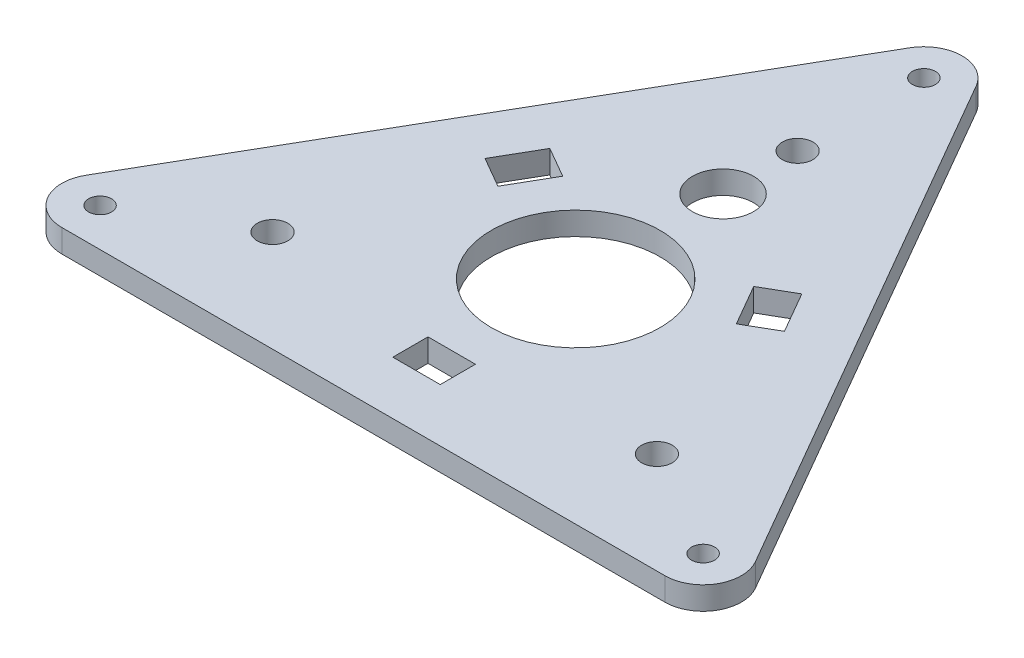
ISO-10303-21;
HEADER;
FILE_DESCRIPTION(('STEP AP214'),'2;1');
FILE_NAME('part.step','',(''),(''),'','','');
FILE_SCHEMA(('AUTOMOTIVE_DESIGN { 1 0 10303 214 1 1 1 1 }'));
ENDSEC;
DATA;
#1=APPLICATION_CONTEXT('core data for automotive mechanical design processes');
#2=APPLICATION_PROTOCOL_DEFINITION('international standard','automotive_design',2000,#1);
#3=PRODUCT_CONTEXT('',#1,'mechanical');
#4=PRODUCT('Part','Part','',(#3));
#5=PRODUCT_RELATED_PRODUCT_CATEGORY('part','',(#4));
#6=PRODUCT_DEFINITION_FORMATION('','',#4);
#7=PRODUCT_DEFINITION_CONTEXT('part definition',#1,'design');
#8=PRODUCT_DEFINITION('design','',#6,#7);
#9=PRODUCT_DEFINITION_SHAPE('','',#8);
#10=(LENGTH_UNIT() NAMED_UNIT(*) SI_UNIT(.MILLI.,.METRE.));
#11=(NAMED_UNIT(*) PLANE_ANGLE_UNIT() SI_UNIT($,.RADIAN.));
#12=(NAMED_UNIT(*) SI_UNIT($,.STERADIAN.) SOLID_ANGLE_UNIT());
#13=UNCERTAINTY_MEASURE_WITH_UNIT(LENGTH_MEASURE(1.E-05),#10,'distance_accuracy_value','');
#14=(GEOMETRIC_REPRESENTATION_CONTEXT(3) GLOBAL_UNCERTAINTY_ASSIGNED_CONTEXT((#13)) GLOBAL_UNIT_ASSIGNED_CONTEXT((#10,
#11,#12)) REPRESENTATION_CONTEXT('',''));
#15=CARTESIAN_POINT('',(0.,0.,0.));
#16=DIRECTION('',(0.,0.,1.));
#17=DIRECTION('',(1.,0.,0.));
#18=AXIS2_PLACEMENT_3D('',#15,#16,#17);
#19=CARTESIAN_POINT('',(0.,3.,-45.5));
#20=DIRECTION('',(0.,1.,0.));
#21=DIRECTION('',(0.,0.,1.));
#22=AXIS2_PLACEMENT_3D('',#19,#20,#21);
#23=PLANE('',#22);
#24=CARTESIAN_POINT('',(25.1147367097487,3.,14.5));
#25=DIRECTION('',(0.,1.,0.));
#26=DIRECTION('',(0.,0.,1.));
#27=AXIS2_PLACEMENT_3D('',#24,#25,#26);
#28=CIRCLE('',#27,2.);
#29=CARTESIAN_POINT('',(25.1147367097487,3.,16.5));
#30=VERTEX_POINT('',#29);
#31=EDGE_CURVE('E268',#30,#30,#28,.T.);
#32=ORIENTED_EDGE('',*,*,#31,.F.);
#33=EDGE_LOOP('',(#32));
#34=FACE_BOUND('',#33,.T.);
#35=CARTESIAN_POINT('',(0.,3.,-29.));
#36=DIRECTION('',(0.,1.,0.));
#37=DIRECTION('',(0.,0.,1.));
#38=AXIS2_PLACEMENT_3D('',#35,#36,#37);
#39=CIRCLE('',#38,2.);
#40=CARTESIAN_POINT('',(0.,3.,-27.));
#41=VERTEX_POINT('',#40);
#42=EDGE_CURVE('E278',#41,#41,#39,.T.);
#43=ORIENTED_EDGE('',*,*,#42,.F.);
#44=EDGE_LOOP('',(#43));
#45=FACE_BOUND('',#44,.T.);
#46=CARTESIAN_POINT('',(39.404155872192,3.,22.75));
#47=DIRECTION('',(0.,1.,0.));
#48=DIRECTION('',(0.,0.,1.));
#49=AXIS2_PLACEMENT_3D('',#46,#47,#48);
#50=CIRCLE('',#49,1.5);
#51=CARTESIAN_POINT('',(39.404155872192,3.,24.25));
#52=VERTEX_POINT('',#51);
#53=EDGE_CURVE('E295',#52,#52,#50,.T.);
#54=ORIENTED_EDGE('',*,*,#53,.F.);
#55=EDGE_LOOP('',(#54));
#56=FACE_BOUND('',#55,.T.);
#57=CARTESIAN_POINT('',(0.,3.,0.));
#58=DIRECTION('',(0.,1.,0.));
#59=DIRECTION('',(0.,0.,1.));
#60=AXIS2_PLACEMENT_3D('',#57,#58,#59);
#61=CIRCLE('',#60,11.025);
#62=CARTESIAN_POINT('',(0.,3.,11.025));
#63=VERTEX_POINT('',#62);
#64=EDGE_CURVE('E304',#63,#63,#61,.T.);
#65=ORIENTED_EDGE('',*,*,#64,.F.);
#66=EDGE_LOOP('',(#65));
#67=FACE_BOUND('',#66,.T.);
#68=CARTESIAN_POINT('',(0.,3.,-45.5));
#69=DIRECTION('',(0.,1.,0.));
#70=DIRECTION('',(0.,0.,1.));
#71=AXIS2_PLACEMENT_3D('',#68,#69,#70);
#72=CIRCLE('',#71,5.00000000000002);
#73=CARTESIAN_POINT('',(4.33012701892221,3.,-48.));
#74=VERTEX_POINT('',#73);
#75=CARTESIAN_POINT('',(-4.33012701892222,3.,-48.));
#76=VERTEX_POINT('',#75);
#77=EDGE_CURVE('E309',#74,#76,#72,.T.);
#78=ORIENTED_EDGE('',*,*,#77,.T.);
#79=DIRECTION('',(-0.5,0.,0.866025403784439));
#80=VECTOR('',#79,1.);
#81=CARTESIAN_POINT('',(-4.33012701892222,3.,-48.));
#82=LINE('',#81,#80);
#83=CARTESIAN_POINT('',(-43.7342828911142,3.,20.25));
#84=VERTEX_POINT('',#83);
#85=EDGE_CURVE('E311',#76,#84,#82,.T.);
#86=ORIENTED_EDGE('',*,*,#85,.T.);
#87=CARTESIAN_POINT('',(-39.404155872192,3.,22.75));
#88=DIRECTION('',(0.,1.,0.));
#89=DIRECTION('',(0.,0.,1.));
#90=AXIS2_PLACEMENT_3D('',#87,#88,#89);
#91=CIRCLE('',#90,5.00000000000002);
#92=CARTESIAN_POINT('',(-39.404155872192,3.,27.75));
#93=VERTEX_POINT('',#92);
#94=EDGE_CURVE('E316',#84,#93,#91,.T.);
#95=ORIENTED_EDGE('',*,*,#94,.T.);
#96=DIRECTION('',(1.,0.,0.));
#97=VECTOR('',#96,1.);
#98=CARTESIAN_POINT('',(-39.404155872192,3.,27.75));
#99=LINE('',#98,#97);
#100=CARTESIAN_POINT('',(39.404155872192,3.,27.7500000000004));
#101=VERTEX_POINT('',#100);
#102=EDGE_CURVE('E318',#93,#101,#99,.T.);
#103=ORIENTED_EDGE('',*,*,#102,.T.);
#104=CARTESIAN_POINT('',(39.4041558721918,3.,22.7500000000003));
#105=DIRECTION('',(0.,1.,0.));
#106=DIRECTION('',(0.,0.,1.));
#107=AXIS2_PLACEMENT_3D('',#104,#105,#106);
#108=CIRCLE('',#107,5.00000000000003);
#109=CARTESIAN_POINT('',(43.7342828911142,3.,20.25));
#110=VERTEX_POINT('',#109);
#111=EDGE_CURVE('E319',#101,#110,#108,.T.);
#112=ORIENTED_EDGE('',*,*,#111,.T.);
#113=DIRECTION('',(-0.5,0.,-0.866025403784438));
#114=VECTOR('',#113,1.);
#115=CARTESIAN_POINT('',(43.7342828911142,3.,20.25));
#116=LINE('',#115,#114);
#117=EDGE_CURVE('E325',#110,#74,#116,.T.);
#118=ORIENTED_EDGE('',*,*,#117,.T.);
#119=EDGE_LOOP('',(#78,#86,#95,#103,#112,#118));
#120=FACE_BOUND('',#119,.T.);
#121=CARTESIAN_POINT('',(0.,3.,-45.5));
#122=DIRECTION('',(0.,1.,0.));
#123=DIRECTION('',(0.,0.,1.));
#124=AXIS2_PLACEMENT_3D('',#121,#122,#123);
#125=CIRCLE('',#124,1.5);
#126=CARTESIAN_POINT('',(0.,3.,-44.));
#127=VERTEX_POINT('',#126);
#128=EDGE_CURVE('E299',#127,#127,#125,.T.);
#129=ORIENTED_EDGE('',*,*,#128,.F.);
#130=EDGE_LOOP('',(#129));
#131=FACE_BOUND('',#130,.T.);
#132=CARTESIAN_POINT('',(-39.404155872192,3.,22.75));
#133=DIRECTION('',(0.,1.,0.));
#134=DIRECTION('',(0.,0.,1.));
#135=AXIS2_PLACEMENT_3D('',#132,#133,#134);
#136=CIRCLE('',#135,1.5);
#137=CARTESIAN_POINT('',(-39.404155872192,3.,24.25));
#138=VERTEX_POINT('',#137);
#139=EDGE_CURVE('E287',#138,#138,#136,.T.);
#140=ORIENTED_EDGE('',*,*,#139,.F.);
#141=EDGE_LOOP('',(#140));
#142=FACE_BOUND('',#141,.T.);
#143=CARTESIAN_POINT('',(0.,3.,-19.25));
#144=DIRECTION('',(0.,1.,0.));
#145=DIRECTION('',(0.,0.,1.));
#146=AXIS2_PLACEMENT_3D('',#143,#144,#145);
#147=CIRCLE('',#146,4.);
#148=CARTESIAN_POINT('',(0.,3.,-15.25));
#149=VERTEX_POINT('',#148);
#150=EDGE_CURVE('E273',#149,#149,#147,.T.);
#151=ORIENTED_EDGE('',*,*,#150,.F.);
#152=EDGE_LOOP('',(#151));
#153=FACE_BOUND('',#152,.T.);
#154=CARTESIAN_POINT('',(-25.1147367097487,3.,14.5));
#155=DIRECTION('',(0.,1.,0.));
#156=DIRECTION('',(0.,0.,1.));
#157=AXIS2_PLACEMENT_3D('',#154,#155,#156);
#158=CIRCLE('',#157,2.);
#159=CARTESIAN_POINT('',(-25.1147367097487,3.,16.5));
#160=VERTEX_POINT('',#159);
#161=EDGE_CURVE('E265',#160,#160,#158,.T.);
#162=ORIENTED_EDGE('',*,*,#161,.F.);
#163=EDGE_LOOP('',(#162));
#164=FACE_BOUND('',#163,.T.);
#165=DIRECTION('',(1.,0.,0.));
#166=VECTOR('',#165,1.);
#167=CARTESIAN_POINT('',(-3.1,3.,20.8));
#168=LINE('',#167,#166);
#169=CARTESIAN_POINT('',(-3.1,3.,20.8));
#170=VERTEX_POINT('',#169);
#171=CARTESIAN_POINT('',(3.1,3.,20.8));
#172=VERTEX_POINT('',#171);
#173=EDGE_CURVE('E233',#170,#172,#168,.T.);
#174=ORIENTED_EDGE('',*,*,#173,.F.);
#175=DIRECTION('',(0.,0.,1.));
#176=VECTOR('',#175,1.);
#177=CARTESIAN_POINT('',(-3.1,3.,16.2));
#178=LINE('',#177,#176);
#179=CARTESIAN_POINT('',(-3.1,3.,16.2));
#180=VERTEX_POINT('',#179);
#181=EDGE_CURVE('E232',#180,#170,#178,.T.);
#182=ORIENTED_EDGE('',*,*,#181,.F.);
#183=DIRECTION('',(-1.,0.,0.));
#184=VECTOR('',#183,1.);
#185=CARTESIAN_POINT('',(-3.1,3.,16.2));
#186=LINE('',#185,#184);
#187=CARTESIAN_POINT('',(3.1,3.,16.2));
#188=VERTEX_POINT('',#187);
#189=EDGE_CURVE('E239',#188,#180,#186,.T.);
#190=ORIENTED_EDGE('',*,*,#189,.F.);
#191=DIRECTION('',(0.,0.,-1.));
#192=VECTOR('',#191,1.);
#193=CARTESIAN_POINT('',(3.1,3.,16.2));
#194=LINE('',#193,#192);
#195=EDGE_CURVE('E237',#172,#188,#194,.T.);
#196=ORIENTED_EDGE('',*,*,#195,.F.);
#197=EDGE_LOOP('',(#174,#182,#190,#196));
#198=FACE_BOUND('',#197,.T.);
#199=DIRECTION('',(-0.866025403784438,0.,-0.500000000000001));
#200=VECTOR('',#199,1.);
#201=CARTESIAN_POINT('',(-12.4796115413079,3.,-10.7846787517318));
#202=LINE('',#201,#200);
#203=CARTESIAN_POINT('',(-12.4796115413079,3.,-10.7846787517318));
#204=VERTEX_POINT('',#203);
#205=CARTESIAN_POINT('',(-16.4633283987163,3.,-13.0846787517318));
#206=VERTEX_POINT('',#205);
#207=EDGE_CURVE('E205',#204,#206,#202,.T.);
#208=ORIENTED_EDGE('',*,*,#207,.F.);
#209=DIRECTION('',(0.5,0.,-0.866025403784439));
#210=VECTOR('',#209,1.);
#211=CARTESIAN_POINT('',(-12.4796115413079,3.,-10.7846787517318));
#212=LINE('',#211,#210);
#213=CARTESIAN_POINT('',(-15.5796115413079,3.,-5.41532124826825));
#214=VERTEX_POINT('',#213);
#215=EDGE_CURVE('E199',#214,#204,#212,.T.);
#216=ORIENTED_EDGE('',*,*,#215,.F.);
#217=DIRECTION('',(0.866025403784439,0.,0.5));
#218=VECTOR('',#217,1.);
#219=CARTESIAN_POINT('',(-15.5796115413079,3.,-5.41532124826825));
#220=LINE('',#219,#218);
#221=CARTESIAN_POINT('',(-19.5633283987164,3.,-7.71532124826825));
#222=VERTEX_POINT('',#221);
#223=EDGE_CURVE('E208',#222,#214,#220,.T.);
#224=ORIENTED_EDGE('',*,*,#223,.F.);
#225=DIRECTION('',(-0.5,0.,0.866025403784439));
#226=VECTOR('',#225,1.);
#227=CARTESIAN_POINT('',(-16.4633283987163,3.,-13.0846787517318));
#228=LINE('',#227,#226);
#229=EDGE_CURVE('E202',#206,#222,#228,.T.);
#230=ORIENTED_EDGE('',*,*,#229,.F.);
#231=EDGE_LOOP('',(#208,#216,#224,#230));
#232=FACE_BOUND('',#231,.T.);
#233=DIRECTION('',(0.866025403784439,0.,-0.5));
#234=VECTOR('',#233,1.);
#235=CARTESIAN_POINT('',(15.5796115413079,3.,-5.41532124826826));
#236=LINE('',#235,#234);
#237=CARTESIAN_POINT('',(15.5796115413079,3.,-5.41532124826826));
#238=VERTEX_POINT('',#237);
#239=CARTESIAN_POINT('',(19.5633283987163,3.,-7.71532124826826));
#240=VERTEX_POINT('',#239);
#241=EDGE_CURVE('E172',#238,#240,#236,.T.);
#242=ORIENTED_EDGE('',*,*,#241,.F.);
#243=DIRECTION('',(0.500000000000001,0.,0.866025403784438));
#244=VECTOR('',#243,1.);
#245=CARTESIAN_POINT('',(15.5796115413079,3.,-5.41532124826826));
#246=LINE('',#245,#244);
#247=CARTESIAN_POINT('',(12.4796115413079,3.,-10.7846787517318));
#248=VERTEX_POINT('',#247);
#249=EDGE_CURVE('E163',#248,#238,#246,.T.);
#250=ORIENTED_EDGE('',*,*,#249,.F.);
#251=DIRECTION('',(-0.866025403784438,0.,0.500000000000001));
#252=VECTOR('',#251,1.);
#253=CARTESIAN_POINT('',(12.4796115413079,3.,-10.7846787517318));
#254=LINE('',#253,#252);
#255=CARTESIAN_POINT('',(16.4633283987163,3.,-13.0846787517318));
#256=VERTEX_POINT('',#255);
#257=EDGE_CURVE('E186',#256,#248,#254,.T.);
#258=ORIENTED_EDGE('',*,*,#257,.F.);
#259=DIRECTION('',(-0.5,0.,-0.866025403784438));
#260=VECTOR('',#259,1.);
#261=CARTESIAN_POINT('',(19.5633283987163,3.,-7.71532124826826));
#262=LINE('',#261,#260);
#263=EDGE_CURVE('E184',#240,#256,#262,.T.);
#264=ORIENTED_EDGE('',*,*,#263,.F.);
#265=EDGE_LOOP('',(#242,#250,#258,#264));
#266=FACE_BOUND('',#265,.T.);
#267=ADVANCED_FACE('F39',(#34,#45,#56,#67,#120,#131,#142,#153,#164,#198,#232,#266),#23,.T.);
#268=CARTESIAN_POINT('',(0.,0.,-45.5));
#269=DIRECTION('',(0.,1.,0.));
#270=DIRECTION('',(0.,0.,1.));
#271=AXIS2_PLACEMENT_3D('',#268,#269,#270);
#272=PLANE('',#271);
#273=DIRECTION('',(0.5,0.,-0.866025403784439));
#274=VECTOR('',#273,1.);
#275=CARTESIAN_POINT('',(-12.4796115413079,0.,-10.7846787517318));
#276=LINE('',#275,#274);
#277=CARTESIAN_POINT('',(-15.5796115413079,0.,-5.41532124826825));
#278=VERTEX_POINT('',#277);
#279=CARTESIAN_POINT('',(-12.4796115413079,0.,-10.7846787517318));
#280=VERTEX_POINT('',#279);
#281=EDGE_CURVE('E176',#278,#280,#276,.T.);
#282=ORIENTED_EDGE('',*,*,#281,.T.);
#283=DIRECTION('',(-0.866025403784438,0.,-0.500000000000001));
#284=VECTOR('',#283,1.);
#285=CARTESIAN_POINT('',(-12.4796115413079,0.,-10.7846787517318));
#286=LINE('',#285,#284);
#287=CARTESIAN_POINT('',(-16.4633283987163,0.,-13.0846787517318));
#288=VERTEX_POINT('',#287);
#289=EDGE_CURVE('E213',#280,#288,#286,.T.);
#290=ORIENTED_EDGE('',*,*,#289,.T.);
#291=DIRECTION('',(-0.5,0.,0.866025403784439));
#292=VECTOR('',#291,1.);
#293=CARTESIAN_POINT('',(-16.4633283987163,0.,-13.0846787517318));
#294=LINE('',#293,#292);
#295=CARTESIAN_POINT('',(-19.5633283987164,0.,-7.71532124826825));
#296=VERTEX_POINT('',#295);
#297=EDGE_CURVE('E216',#288,#296,#294,.T.);
#298=ORIENTED_EDGE('',*,*,#297,.T.);
#299=DIRECTION('',(0.866025403784439,0.,0.5));
#300=VECTOR('',#299,1.);
#301=CARTESIAN_POINT('',(-15.5796115413079,0.,-5.41532124826825));
#302=LINE('',#301,#300);
#303=EDGE_CURVE('E201',#296,#278,#302,.T.);
#304=ORIENTED_EDGE('',*,*,#303,.T.);
#305=EDGE_LOOP('',(#282,#290,#298,#304));
#306=FACE_BOUND('',#305,.T.);
#307=CARTESIAN_POINT('',(-25.1147367097487,0.,14.5));
#308=DIRECTION('',(0.,1.,0.));
#309=DIRECTION('',(0.,0.,1.));
#310=AXIS2_PLACEMENT_3D('',#307,#308,#309);
#311=CIRCLE('',#310,2.);
#312=CARTESIAN_POINT('',(-25.1147367097487,0.,16.5));
#313=VERTEX_POINT('',#312);
#314=EDGE_CURVE('E261',#313,#313,#311,.T.);
#315=ORIENTED_EDGE('',*,*,#314,.T.);
#316=EDGE_LOOP('',(#315));
#317=FACE_BOUND('',#316,.T.);
#318=CARTESIAN_POINT('',(25.1147367097487,0.,14.5));
#319=DIRECTION('',(0.,1.,0.));
#320=DIRECTION('',(0.,0.,1.));
#321=AXIS2_PLACEMENT_3D('',#318,#319,#320);
#322=CIRCLE('',#321,2.);
#323=CARTESIAN_POINT('',(25.1147367097487,0.,16.5));
#324=VERTEX_POINT('',#323);
#325=EDGE_CURVE('E264',#324,#324,#322,.T.);
#326=ORIENTED_EDGE('',*,*,#325,.T.);
#327=EDGE_LOOP('',(#326));
#328=FACE_BOUND('',#327,.T.);
#329=CARTESIAN_POINT('',(0.,0.,-19.25));
#330=DIRECTION('',(0.,1.,0.));
#331=DIRECTION('',(0.,0.,1.));
#332=AXIS2_PLACEMENT_3D('',#329,#330,#331);
#333=CIRCLE('',#332,4.);
#334=CARTESIAN_POINT('',(0.,0.,-15.25));
#335=VERTEX_POINT('',#334);
#336=EDGE_CURVE('E271',#335,#335,#333,.T.);
#337=ORIENTED_EDGE('',*,*,#336,.T.);
#338=EDGE_LOOP('',(#337));
#339=FACE_BOUND('',#338,.T.);
#340=CARTESIAN_POINT('',(0.,0.,-29.));
#341=DIRECTION('',(0.,1.,0.));
#342=DIRECTION('',(0.,0.,1.));
#343=AXIS2_PLACEMENT_3D('',#340,#341,#342);
#344=CIRCLE('',#343,2.);
#345=CARTESIAN_POINT('',(0.,0.,-27.));
#346=VERTEX_POINT('',#345);
#347=EDGE_CURVE('E280',#346,#346,#344,.T.);
#348=ORIENTED_EDGE('',*,*,#347,.T.);
#349=EDGE_LOOP('',(#348));
#350=FACE_BOUND('',#349,.T.);
#351=CARTESIAN_POINT('',(-39.404155872192,0.,22.75));
#352=DIRECTION('',(0.,1.,0.));
#353=DIRECTION('',(0.,0.,1.));
#354=AXIS2_PLACEMENT_3D('',#351,#352,#353);
#355=CIRCLE('',#354,1.5);
#356=CARTESIAN_POINT('',(-39.404155872192,0.,24.25));
#357=VERTEX_POINT('',#356);
#358=EDGE_CURVE('E284',#357,#357,#355,.T.);
#359=ORIENTED_EDGE('',*,*,#358,.T.);
#360=EDGE_LOOP('',(#359));
#361=FACE_BOUND('',#360,.T.);
#362=CARTESIAN_POINT('',(39.404155872192,0.,22.75));
#363=DIRECTION('',(0.,1.,0.));
#364=DIRECTION('',(0.,0.,1.));
#365=AXIS2_PLACEMENT_3D('',#362,#363,#364);
#366=CIRCLE('',#365,1.5);
#367=CARTESIAN_POINT('',(39.404155872192,0.,24.25));
#368=VERTEX_POINT('',#367);
#369=EDGE_CURVE('E289',#368,#368,#366,.T.);
#370=ORIENTED_EDGE('',*,*,#369,.T.);
#371=EDGE_LOOP('',(#370));
#372=FACE_BOUND('',#371,.T.);
#373=CARTESIAN_POINT('',(0.,0.,-45.5));
#374=DIRECTION('',(0.,1.,0.));
#375=DIRECTION('',(0.,0.,1.));
#376=AXIS2_PLACEMENT_3D('',#373,#374,#375);
#377=CIRCLE('',#376,1.5);
#378=CARTESIAN_POINT('',(0.,0.,-44.));
#379=VERTEX_POINT('',#378);
#380=EDGE_CURVE('E293',#379,#379,#377,.T.);
#381=ORIENTED_EDGE('',*,*,#380,.T.);
#382=EDGE_LOOP('',(#381));
#383=FACE_BOUND('',#382,.T.);
#384=CARTESIAN_POINT('',(0.,0.,0.));
#385=DIRECTION('',(0.,1.,0.));
#386=DIRECTION('',(0.,0.,1.));
#387=AXIS2_PLACEMENT_3D('',#384,#385,#386);
#388=CIRCLE('',#387,11.025);
#389=CARTESIAN_POINT('',(0.,0.,11.025));
#390=VERTEX_POINT('',#389);
#391=EDGE_CURVE('E302',#390,#390,#388,.T.);
#392=ORIENTED_EDGE('',*,*,#391,.T.);
#393=EDGE_LOOP('',(#392));
#394=FACE_BOUND('',#393,.T.);
#395=CARTESIAN_POINT('',(0.,0.,-45.5));
#396=DIRECTION('',(0.,1.,0.));
#397=DIRECTION('',(0.,0.,1.));
#398=AXIS2_PLACEMENT_3D('',#395,#396,#397);
#399=CIRCLE('',#398,5.00000000000002);
#400=CARTESIAN_POINT('',(4.33012701892221,0.,-48.));
#401=VERTEX_POINT('',#400);
#402=CARTESIAN_POINT('',(-4.33012701892222,0.,-48.));
#403=VERTEX_POINT('',#402);
#404=EDGE_CURVE('E307',#401,#403,#399,.T.);
#405=ORIENTED_EDGE('',*,*,#404,.F.);
#406=DIRECTION('',(-0.5,0.,-0.866025403784438));
#407=VECTOR('',#406,1.);
#408=CARTESIAN_POINT('',(43.7342828911142,0.,20.25));
#409=LINE('',#408,#407);
#410=CARTESIAN_POINT('',(43.7342828911142,0.,20.25));
#411=VERTEX_POINT('',#410);
#412=EDGE_CURVE('E314',#411,#401,#409,.T.);
#413=ORIENTED_EDGE('',*,*,#412,.F.);
#414=CARTESIAN_POINT('',(39.4041558721918,0.,22.7500000000003));
#415=DIRECTION('',(0.,1.,0.));
#416=DIRECTION('',(0.,0.,1.));
#417=AXIS2_PLACEMENT_3D('',#414,#415,#416);
#418=CIRCLE('',#417,5.00000000000003);
#419=CARTESIAN_POINT('',(39.404155872192,0.,27.7500000000004));
#420=VERTEX_POINT('',#419);
#421=EDGE_CURVE('E334',#420,#411,#418,.T.);
#422=ORIENTED_EDGE('',*,*,#421,.F.);
#423=DIRECTION('',(1.,0.,0.));
#424=VECTOR('',#423,1.);
#425=CARTESIAN_POINT('',(-39.404155872192,0.,27.75));
#426=LINE('',#425,#424);
#427=CARTESIAN_POINT('',(-39.404155872192,0.,27.75));
#428=VERTEX_POINT('',#427);
#429=EDGE_CURVE('E332',#428,#420,#426,.T.);
#430=ORIENTED_EDGE('',*,*,#429,.F.);
#431=CARTESIAN_POINT('',(-39.404155872192,0.,22.75));
#432=DIRECTION('',(0.,1.,0.));
#433=DIRECTION('',(0.,0.,1.));
#434=AXIS2_PLACEMENT_3D('',#431,#432,#433);
#435=CIRCLE('',#434,5.00000000000002);
#436=CARTESIAN_POINT('',(-43.7342828911142,0.,20.25));
#437=VERTEX_POINT('',#436);
#438=EDGE_CURVE('E328',#437,#428,#435,.T.);
#439=ORIENTED_EDGE('',*,*,#438,.F.);
#440=DIRECTION('',(-0.5,0.,0.866025403784439));
#441=VECTOR('',#440,1.);
#442=CARTESIAN_POINT('',(-4.33012701892222,0.,-48.));
#443=LINE('',#442,#441);
#444=EDGE_CURVE('E330',#403,#437,#443,.T.);
#445=ORIENTED_EDGE('',*,*,#444,.F.);
#446=EDGE_LOOP('',(#405,#413,#422,#430,#439,#445));
#447=FACE_BOUND('',#446,.T.);
#448=DIRECTION('',(0.,0.,1.));
#449=VECTOR('',#448,1.);
#450=CARTESIAN_POINT('',(-3.1,0.,16.2));
#451=LINE('',#450,#449);
#452=CARTESIAN_POINT('',(-3.1,0.,16.2));
#453=VERTEX_POINT('',#452);
#454=CARTESIAN_POINT('',(-3.1,0.,20.8));
#455=VERTEX_POINT('',#454);
#456=EDGE_CURVE('E230',#453,#455,#451,.T.);
#457=ORIENTED_EDGE('',*,*,#456,.T.);
#458=DIRECTION('',(1.,0.,0.));
#459=VECTOR('',#458,1.);
#460=CARTESIAN_POINT('',(-3.1,0.,20.8));
#461=LINE('',#460,#459);
#462=CARTESIAN_POINT('',(3.1,0.,20.8));
#463=VERTEX_POINT('',#462);
#464=EDGE_CURVE('E243',#455,#463,#461,.T.);
#465=ORIENTED_EDGE('',*,*,#464,.T.);
#466=DIRECTION('',(0.,0.,-1.));
#467=VECTOR('',#466,1.);
#468=CARTESIAN_POINT('',(3.1,0.,16.2));
#469=LINE('',#468,#467);
#470=CARTESIAN_POINT('',(3.1,0.,16.2));
#471=VERTEX_POINT('',#470);
#472=EDGE_CURVE('E250',#463,#471,#469,.T.);
#473=ORIENTED_EDGE('',*,*,#472,.T.);
#474=DIRECTION('',(-1.,0.,0.));
#475=VECTOR('',#474,1.);
#476=CARTESIAN_POINT('',(-3.1,0.,16.2));
#477=LINE('',#476,#475);
#478=EDGE_CURVE('E234',#471,#453,#477,.T.);
#479=ORIENTED_EDGE('',*,*,#478,.T.);
#480=EDGE_LOOP('',(#457,#465,#473,#479));
#481=FACE_BOUND('',#480,.T.);
#482=DIRECTION('',(0.500000000000001,0.,0.866025403784438));
#483=VECTOR('',#482,1.);
#484=CARTESIAN_POINT('',(15.5796115413079,0.,-5.41532124826826));
#485=LINE('',#484,#483);
#486=CARTESIAN_POINT('',(12.4796115413079,0.,-10.7846787517318));
#487=VERTEX_POINT('',#486);
#488=CARTESIAN_POINT('',(15.5796115413079,0.,-5.41532124826826));
#489=VERTEX_POINT('',#488);
#490=EDGE_CURVE('E62',#487,#489,#485,.T.);
#491=ORIENTED_EDGE('',*,*,#490,.T.);
#492=DIRECTION('',(0.866025403784439,0.,-0.5));
#493=VECTOR('',#492,1.);
#494=CARTESIAN_POINT('',(15.5796115413079,0.,-5.41532124826826));
#495=LINE('',#494,#493);
#496=CARTESIAN_POINT('',(19.5633283987163,0.,-7.71532124826826));
#497=VERTEX_POINT('',#496);
#498=EDGE_CURVE('E179',#489,#497,#495,.T.);
#499=ORIENTED_EDGE('',*,*,#498,.T.);
#500=DIRECTION('',(-0.5,0.,-0.866025403784438));
#501=VECTOR('',#500,1.);
#502=CARTESIAN_POINT('',(19.5633283987163,0.,-7.71532124826826));
#503=LINE('',#502,#501);
#504=CARTESIAN_POINT('',(16.4633283987163,0.,-13.0846787517318));
#505=VERTEX_POINT('',#504);
#506=EDGE_CURVE('E195',#497,#505,#503,.T.);
#507=ORIENTED_EDGE('',*,*,#506,.T.);
#508=DIRECTION('',(-0.866025403784438,0.,0.500000000000001));
#509=VECTOR('',#508,1.);
#510=CARTESIAN_POINT('',(12.4796115413079,0.,-10.7846787517318));
#511=LINE('',#510,#509);
#512=EDGE_CURVE('E174',#505,#487,#511,.T.);
#513=ORIENTED_EDGE('',*,*,#512,.T.);
#514=EDGE_LOOP('',(#491,#499,#507,#513));
#515=FACE_BOUND('',#514,.T.);
#516=ADVANCED_FACE('F360',(#306,#317,#328,#339,#350,#361,#372,#383,#394,#447,#481,#515),#272,.F.);
#517=CARTESIAN_POINT('',(0.,3.,-45.5));
#518=DIRECTION('',(0.,-1.,0.));
#519=DIRECTION('',(0.,0.,-1.));
#520=AXIS2_PLACEMENT_3D('',#517,#518,#519);
#521=CYLINDRICAL_SURFACE('',#520,5.00000000000002);
#522=ORIENTED_EDGE('',*,*,#404,.T.);
#523=DIRECTION('',(0.,-1.,0.));
#524=VECTOR('',#523,1.);
#525=CARTESIAN_POINT('',(-4.33012701892222,3.,-48.));
#526=LINE('',#525,#524);
#527=EDGE_CURVE('E11',#76,#403,#526,.T.);
#528=ORIENTED_EDGE('',*,*,#527,.F.);
#529=ORIENTED_EDGE('',*,*,#77,.F.);
#530=DIRECTION('',(0.,-1.,0.));
#531=VECTOR('',#530,1.);
#532=CARTESIAN_POINT('',(4.33012701892221,3.,-48.));
#533=LINE('',#532,#531);
#534=EDGE_CURVE('E322',#74,#401,#533,.T.);
#535=ORIENTED_EDGE('',*,*,#534,.T.);
#536=EDGE_LOOP('',(#522,#528,#529,#535));
#537=FACE_BOUND('',#536,.T.);
#538=ADVANCED_FACE('F41',(#537),#521,.T.);
#539=CARTESIAN_POINT('',(-4.33012701892222,3.,-48.));
#540=DIRECTION('',(0.866025403784439,0.,0.5));
#541=DIRECTION('',(0.5,0.,-0.866025403784439));
#542=AXIS2_PLACEMENT_3D('',#539,#540,#541);
#543=PLANE('',#542);
#544=ORIENTED_EDGE('',*,*,#444,.T.);
#545=DIRECTION('',(0.,-1.,0.));
#546=VECTOR('',#545,1.);
#547=CARTESIAN_POINT('',(-43.7342828911142,3.,20.25));
#548=LINE('',#547,#546);
#549=EDGE_CURVE('E50',#84,#437,#548,.T.);
#550=ORIENTED_EDGE('',*,*,#549,.F.);
#551=ORIENTED_EDGE('',*,*,#85,.F.);
#552=ORIENTED_EDGE('',*,*,#527,.T.);
#553=EDGE_LOOP('',(#544,#550,#551,#552));
#554=FACE_BOUND('',#553,.T.);
#555=ADVANCED_FACE('F374',(#554),#543,.F.);
#556=CARTESIAN_POINT('',(-39.404155872192,3.,22.75));
#557=DIRECTION('',(0.,-1.,0.));
#558=DIRECTION('',(0.,0.,-1.));
#559=AXIS2_PLACEMENT_3D('',#556,#557,#558);
#560=CYLINDRICAL_SURFACE('',#559,5.00000000000002);
#561=ORIENTED_EDGE('',*,*,#438,.T.);
#562=DIRECTION('',(0.,-1.,0.));
#563=VECTOR('',#562,1.);
#564=CARTESIAN_POINT('',(-39.404155872192,3.,27.75));
#565=LINE('',#564,#563);
#566=EDGE_CURVE('E344',#93,#428,#565,.T.);
#567=ORIENTED_EDGE('',*,*,#566,.F.);
#568=ORIENTED_EDGE('',*,*,#94,.F.);
#569=ORIENTED_EDGE('',*,*,#549,.T.);
#570=EDGE_LOOP('',(#561,#567,#568,#569));
#571=FACE_BOUND('',#570,.T.);
#572=ADVANCED_FACE('F351',(#571),#560,.T.);
#573=CARTESIAN_POINT('',(-39.404155872192,3.,27.75));
#574=DIRECTION('',(0.,0.,-1.));
#575=DIRECTION('',(-1.,0.,0.));
#576=AXIS2_PLACEMENT_3D('',#573,#574,#575);
#577=PLANE('',#576);
#578=ORIENTED_EDGE('',*,*,#429,.T.);
#579=DIRECTION('',(0.,-1.,0.));
#580=VECTOR('',#579,1.);
#581=CARTESIAN_POINT('',(39.404155872192,3.,27.7500000000004));
#582=LINE('',#581,#580);
#583=EDGE_CURVE('E342',#101,#420,#582,.T.);
#584=ORIENTED_EDGE('',*,*,#583,.F.);
#585=ORIENTED_EDGE('',*,*,#102,.F.);
#586=ORIENTED_EDGE('',*,*,#566,.T.);
#587=EDGE_LOOP('',(#578,#584,#585,#586));
#588=FACE_BOUND('',#587,.T.);
#589=ADVANCED_FACE('F361',(#588),#577,.F.);
#590=CARTESIAN_POINT('',(39.4041558721918,3.,22.7500000000003));
#591=DIRECTION('',(0.,-1.,0.));
#592=DIRECTION('',(0.,0.,-1.));
#593=AXIS2_PLACEMENT_3D('',#590,#591,#592);
#594=CYLINDRICAL_SURFACE('',#593,5.00000000000003);
#595=ORIENTED_EDGE('',*,*,#421,.T.);
#596=DIRECTION('',(0.,-1.,0.));
#597=VECTOR('',#596,1.);
#598=CARTESIAN_POINT('',(43.7342828911142,3.,20.25));
#599=LINE('',#598,#597);
#600=EDGE_CURVE('E339',#110,#411,#599,.T.);
#601=ORIENTED_EDGE('',*,*,#600,.F.);
#602=ORIENTED_EDGE('',*,*,#111,.F.);
#603=ORIENTED_EDGE('',*,*,#583,.T.);
#604=EDGE_LOOP('',(#595,#601,#602,#603));
#605=FACE_BOUND('',#604,.T.);
#606=ADVANCED_FACE('F370',(#605),#594,.T.);
#607=CARTESIAN_POINT('',(43.7342828911142,3.,20.25));
#608=DIRECTION('',(-0.866025403784439,0.,0.5));
#609=DIRECTION('',(0.5,0.,0.866025403784439));
#610=AXIS2_PLACEMENT_3D('',#607,#608,#609);
#611=PLANE('',#610);
#612=ORIENTED_EDGE('',*,*,#412,.T.);
#613=ORIENTED_EDGE('',*,*,#534,.F.);
#614=ORIENTED_EDGE('',*,*,#117,.F.);
#615=ORIENTED_EDGE('',*,*,#600,.T.);
#616=EDGE_LOOP('',(#612,#613,#614,#615));
#617=FACE_BOUND('',#616,.T.);
#618=ADVANCED_FACE('F378',(#617),#611,.F.);
#619=CARTESIAN_POINT('',(0.,3.,0.));
#620=DIRECTION('',(0.,-1.,0.));
#621=DIRECTION('',(0.,0.,-1.));
#622=AXIS2_PLACEMENT_3D('',#619,#620,#621);
#623=CYLINDRICAL_SURFACE('',#622,11.025);
#624=ORIENTED_EDGE('',*,*,#64,.T.);
#625=EDGE_LOOP('',(#624));
#626=FACE_BOUND('',#625,.T.);
#627=ORIENTED_EDGE('',*,*,#391,.F.);
#628=EDGE_LOOP('',(#627));
#629=FACE_BOUND('',#628,.T.);
#630=ADVANCED_FACE('F379',(#626,#629),#623,.F.);
#631=CARTESIAN_POINT('',(0.,3.,-45.5));
#632=DIRECTION('',(0.,-1.,0.));
#633=DIRECTION('',(0.,0.,-1.));
#634=AXIS2_PLACEMENT_3D('',#631,#632,#633);
#635=CYLINDRICAL_SURFACE('',#634,1.5);
#636=ORIENTED_EDGE('',*,*,#128,.T.);
#637=EDGE_LOOP('',(#636));
#638=FACE_BOUND('',#637,.T.);
#639=ORIENTED_EDGE('',*,*,#380,.F.);
#640=EDGE_LOOP('',(#639));
#641=FACE_BOUND('',#640,.T.);
#642=ADVANCED_FACE('F387',(#638,#641),#635,.F.);
#643=CARTESIAN_POINT('',(39.404155872192,3.,22.75));
#644=DIRECTION('',(0.,-1.,0.));
#645=DIRECTION('',(0.,0.,-1.));
#646=AXIS2_PLACEMENT_3D('',#643,#644,#645);
#647=CYLINDRICAL_SURFACE('',#646,1.5);
#648=ORIENTED_EDGE('',*,*,#53,.T.);
#649=EDGE_LOOP('',(#648));
#650=FACE_BOUND('',#649,.T.);
#651=ORIENTED_EDGE('',*,*,#369,.F.);
#652=EDGE_LOOP('',(#651));
#653=FACE_BOUND('',#652,.T.);
#654=ADVANCED_FACE('F401',(#650,#653),#647,.F.);
#655=CARTESIAN_POINT('',(-39.404155872192,3.,22.75));
#656=DIRECTION('',(0.,-1.,0.));
#657=DIRECTION('',(0.,0.,-1.));
#658=AXIS2_PLACEMENT_3D('',#655,#656,#657);
#659=CYLINDRICAL_SURFACE('',#658,1.5);
#660=ORIENTED_EDGE('',*,*,#139,.T.);
#661=EDGE_LOOP('',(#660));
#662=FACE_BOUND('',#661,.T.);
#663=ORIENTED_EDGE('',*,*,#358,.F.);
#664=EDGE_LOOP('',(#663));
#665=FACE_BOUND('',#664,.T.);
#666=ADVANCED_FACE('F407',(#662,#665),#659,.F.);
#667=CARTESIAN_POINT('',(0.,3.,-29.));
#668=DIRECTION('',(0.,-1.,0.));
#669=DIRECTION('',(0.,0.,-1.));
#670=AXIS2_PLACEMENT_3D('',#667,#668,#669);
#671=CYLINDRICAL_SURFACE('',#670,2.);
#672=ORIENTED_EDGE('',*,*,#42,.T.);
#673=EDGE_LOOP('',(#672));
#674=FACE_BOUND('',#673,.T.);
#675=ORIENTED_EDGE('',*,*,#347,.F.);
#676=EDGE_LOOP('',(#675));
#677=FACE_BOUND('',#676,.T.);
#678=ADVANCED_FACE('F412',(#674,#677),#671,.F.);
#679=CARTESIAN_POINT('',(0.,3.,-19.25));
#680=DIRECTION('',(0.,-1.,0.));
#681=DIRECTION('',(0.,0.,-1.));
#682=AXIS2_PLACEMENT_3D('',#679,#680,#681);
#683=CYLINDRICAL_SURFACE('',#682,4.);
#684=ORIENTED_EDGE('',*,*,#150,.T.);
#685=EDGE_LOOP('',(#684));
#686=FACE_BOUND('',#685,.T.);
#687=ORIENTED_EDGE('',*,*,#336,.F.);
#688=EDGE_LOOP('',(#687));
#689=FACE_BOUND('',#688,.T.);
#690=ADVANCED_FACE('F411',(#686,#689),#683,.F.);
#691=CARTESIAN_POINT('',(25.1147367097487,3.,14.5));
#692=DIRECTION('',(0.,-1.,0.));
#693=DIRECTION('',(0.,0.,-1.));
#694=AXIS2_PLACEMENT_3D('',#691,#692,#693);
#695=CYLINDRICAL_SURFACE('',#694,2.);
#696=ORIENTED_EDGE('',*,*,#31,.T.);
#697=EDGE_LOOP('',(#696));
#698=FACE_BOUND('',#697,.T.);
#699=ORIENTED_EDGE('',*,*,#325,.F.);
#700=EDGE_LOOP('',(#699));
#701=FACE_BOUND('',#700,.T.);
#702=ADVANCED_FACE('F420',(#698,#701),#695,.F.);
#703=CARTESIAN_POINT('',(-25.1147367097487,3.,14.5));
#704=DIRECTION('',(0.,-1.,0.));
#705=DIRECTION('',(0.,0.,-1.));
#706=AXIS2_PLACEMENT_3D('',#703,#704,#705);
#707=CYLINDRICAL_SURFACE('',#706,2.);
#708=ORIENTED_EDGE('',*,*,#161,.T.);
#709=EDGE_LOOP('',(#708));
#710=FACE_BOUND('',#709,.T.);
#711=ORIENTED_EDGE('',*,*,#314,.F.);
#712=EDGE_LOOP('',(#711));
#713=FACE_BOUND('',#712,.T.);
#714=ADVANCED_FACE('F421',(#710,#713),#707,.F.);
#715=CARTESIAN_POINT('',(-3.1,3.,16.2));
#716=DIRECTION('',(1.,0.,0.));
#717=DIRECTION('',(0.,0.,-1.));
#718=AXIS2_PLACEMENT_3D('',#715,#716,#717);
#719=PLANE('',#718);
#720=ORIENTED_EDGE('',*,*,#456,.F.);
#721=DIRECTION('',(0.,-1.,0.));
#722=VECTOR('',#721,1.);
#723=CARTESIAN_POINT('',(-3.1,3.,16.2));
#724=LINE('',#723,#722);
#725=EDGE_CURVE('E241',#180,#453,#724,.T.);
#726=ORIENTED_EDGE('',*,*,#725,.F.);
#727=ORIENTED_EDGE('',*,*,#181,.T.);
#728=DIRECTION('',(0.,-1.,0.));
#729=VECTOR('',#728,1.);
#730=CARTESIAN_POINT('',(-3.1,3.,20.8));
#731=LINE('',#730,#729);
#732=EDGE_CURVE('E256',#170,#455,#731,.T.);
#733=ORIENTED_EDGE('',*,*,#732,.T.);
#734=EDGE_LOOP('',(#720,#726,#727,#733));
#735=FACE_BOUND('',#734,.T.);
#736=ADVANCED_FACE('F430',(#735),#719,.T.);
#737=CARTESIAN_POINT('',(-3.1,3.,20.8));
#738=DIRECTION('',(0.,0.,-1.));
#739=DIRECTION('',(-1.,0.,0.));
#740=AXIS2_PLACEMENT_3D('',#737,#738,#739);
#741=PLANE('',#740);
#742=ORIENTED_EDGE('',*,*,#464,.F.);
#743=ORIENTED_EDGE('',*,*,#732,.F.);
#744=ORIENTED_EDGE('',*,*,#173,.T.);
#745=DIRECTION('',(0.,-1.,0.));
#746=VECTOR('',#745,1.);
#747=CARTESIAN_POINT('',(3.1,3.,20.8));
#748=LINE('',#747,#746);
#749=EDGE_CURVE('E258',#172,#463,#748,.T.);
#750=ORIENTED_EDGE('',*,*,#749,.T.);
#751=EDGE_LOOP('',(#742,#743,#744,#750));
#752=FACE_BOUND('',#751,.T.);
#753=ADVANCED_FACE('F431',(#752),#741,.T.);
#754=CARTESIAN_POINT('',(3.1,3.,16.2));
#755=DIRECTION('',(-1.,0.,0.));
#756=DIRECTION('',(0.,0.,1.));
#757=AXIS2_PLACEMENT_3D('',#754,#755,#756);
#758=PLANE('',#757);
#759=ORIENTED_EDGE('',*,*,#472,.F.);
#760=ORIENTED_EDGE('',*,*,#749,.F.);
#761=ORIENTED_EDGE('',*,*,#195,.T.);
#762=DIRECTION('',(0.,-1.,0.));
#763=VECTOR('',#762,1.);
#764=CARTESIAN_POINT('',(3.1,3.,16.2));
#765=LINE('',#764,#763);
#766=EDGE_CURVE('E255',#188,#471,#765,.T.);
#767=ORIENTED_EDGE('',*,*,#766,.T.);
#768=EDGE_LOOP('',(#759,#760,#761,#767));
#769=FACE_BOUND('',#768,.T.);
#770=ADVANCED_FACE('F434',(#769),#758,.T.);
#771=CARTESIAN_POINT('',(-3.1,3.,16.2));
#772=DIRECTION('',(0.,0.,1.));
#773=DIRECTION('',(1.,0.,0.));
#774=AXIS2_PLACEMENT_3D('',#771,#772,#773);
#775=PLANE('',#774);
#776=ORIENTED_EDGE('',*,*,#478,.F.);
#777=ORIENTED_EDGE('',*,*,#766,.F.);
#778=ORIENTED_EDGE('',*,*,#189,.T.);
#779=ORIENTED_EDGE('',*,*,#725,.T.);
#780=EDGE_LOOP('',(#776,#777,#778,#779));
#781=FACE_BOUND('',#780,.T.);
#782=ADVANCED_FACE('F438',(#781),#775,.T.);
#783=CARTESIAN_POINT('',(-12.4796115413079,3.,-10.7846787517318));
#784=DIRECTION('',(-0.866025403784439,0.,-0.5));
#785=DIRECTION('',(-0.5,0.,0.866025403784439));
#786=AXIS2_PLACEMENT_3D('',#783,#784,#785);
#787=PLANE('',#786);
#788=ORIENTED_EDGE('',*,*,#281,.F.);
#789=DIRECTION('',(0.,-1.,0.));
#790=VECTOR('',#789,1.);
#791=CARTESIAN_POINT('',(-15.5796115413079,3.,-5.41532124826825));
#792=LINE('',#791,#790);
#793=EDGE_CURVE('E209',#214,#278,#792,.T.);
#794=ORIENTED_EDGE('',*,*,#793,.F.);
#795=ORIENTED_EDGE('',*,*,#215,.T.);
#796=DIRECTION('',(0.,-1.,0.));
#797=VECTOR('',#796,1.);
#798=CARTESIAN_POINT('',(-12.4796115413079,3.,-10.7846787517318));
#799=LINE('',#798,#797);
#800=EDGE_CURVE('E227',#204,#280,#799,.T.);
#801=ORIENTED_EDGE('',*,*,#800,.T.);
#802=EDGE_LOOP('',(#788,#794,#795,#801));
#803=FACE_BOUND('',#802,.T.);
#804=ADVANCED_FACE('F444',(#803),#787,.T.);
#805=CARTESIAN_POINT('',(-12.4796115413079,3.,-10.7846787517318));
#806=DIRECTION('',(-0.500000000000001,0.,0.866025403784438));
#807=DIRECTION('',(0.866025403784438,0.,0.500000000000001));
#808=AXIS2_PLACEMENT_3D('',#805,#806,#807);
#809=PLANE('',#808);
#810=ORIENTED_EDGE('',*,*,#289,.F.);
#811=ORIENTED_EDGE('',*,*,#800,.F.);
#812=ORIENTED_EDGE('',*,*,#207,.T.);
#813=DIRECTION('',(0.,-1.,0.));
#814=VECTOR('',#813,1.);
#815=CARTESIAN_POINT('',(-16.4633283987163,3.,-13.0846787517318));
#816=LINE('',#815,#814);
#817=EDGE_CURVE('E223',#206,#288,#816,.T.);
#818=ORIENTED_EDGE('',*,*,#817,.T.);
#819=EDGE_LOOP('',(#810,#811,#812,#818));
#820=FACE_BOUND('',#819,.T.);
#821=ADVANCED_FACE('F447',(#820),#809,.T.);
#822=CARTESIAN_POINT('',(-16.4633283987163,3.,-13.0846787517318));
#823=DIRECTION('',(0.866025403784439,0.,0.5));
#824=DIRECTION('',(0.5,0.,-0.866025403784439));
#825=AXIS2_PLACEMENT_3D('',#822,#823,#824);
#826=PLANE('',#825);
#827=ORIENTED_EDGE('',*,*,#297,.F.);
#828=ORIENTED_EDGE('',*,*,#817,.F.);
#829=ORIENTED_EDGE('',*,*,#229,.T.);
#830=DIRECTION('',(0.,-1.,0.));
#831=VECTOR('',#830,1.);
#832=CARTESIAN_POINT('',(-19.5633283987164,3.,-7.71532124826825));
#833=LINE('',#832,#831);
#834=EDGE_CURVE('E224',#222,#296,#833,.T.);
#835=ORIENTED_EDGE('',*,*,#834,.T.);
#836=EDGE_LOOP('',(#827,#828,#829,#835));
#837=FACE_BOUND('',#836,.T.);
#838=ADVANCED_FACE('F452',(#837),#826,.T.);
#839=CARTESIAN_POINT('',(-15.5796115413079,3.,-5.41532124826825));
#840=DIRECTION('',(0.5,0.,-0.866025403784439));
#841=DIRECTION('',(-0.866025403784439,0.,-0.5));
#842=AXIS2_PLACEMENT_3D('',#839,#840,#841);
#843=PLANE('',#842);
#844=ORIENTED_EDGE('',*,*,#303,.F.);
#845=ORIENTED_EDGE('',*,*,#834,.F.);
#846=ORIENTED_EDGE('',*,*,#223,.T.);
#847=ORIENTED_EDGE('',*,*,#793,.T.);
#848=EDGE_LOOP('',(#844,#845,#846,#847));
#849=FACE_BOUND('',#848,.T.);
#850=ADVANCED_FACE('F451',(#849),#843,.T.);
#851=CARTESIAN_POINT('',(15.5796115413079,3.,-5.41532124826826));
#852=DIRECTION('',(0.866025403784438,0.,-0.500000000000001));
#853=DIRECTION('',(-0.500000000000001,0.,-0.866025403784438));
#854=AXIS2_PLACEMENT_3D('',#851,#852,#853);
#855=PLANE('',#854);
#856=ORIENTED_EDGE('',*,*,#490,.F.);
#857=DIRECTION('',(0.,-1.,0.));
#858=VECTOR('',#857,1.);
#859=CARTESIAN_POINT('',(12.4796115413079,3.,-10.7846787517318));
#860=LINE('',#859,#858);
#861=EDGE_CURVE('E169',#248,#487,#860,.T.);
#862=ORIENTED_EDGE('',*,*,#861,.F.);
#863=ORIENTED_EDGE('',*,*,#249,.T.);
#864=DIRECTION('',(0.,-1.,0.));
#865=VECTOR('',#864,1.);
#866=CARTESIAN_POINT('',(15.5796115413079,3.,-5.41532124826826));
#867=LINE('',#866,#865);
#868=EDGE_CURVE('E170',#238,#489,#867,.T.);
#869=ORIENTED_EDGE('',*,*,#868,.T.);
#870=EDGE_LOOP('',(#856,#862,#863,#869));
#871=FACE_BOUND('',#870,.T.);
#872=ADVANCED_FACE('F167',(#871),#855,.T.);
#873=CARTESIAN_POINT('',(15.5796115413079,3.,-5.41532124826826));
#874=DIRECTION('',(-0.5,0.,-0.866025403784439));
#875=DIRECTION('',(-0.866025403784439,0.,0.5));
#876=AXIS2_PLACEMENT_3D('',#873,#874,#875);
#877=PLANE('',#876);
#878=ORIENTED_EDGE('',*,*,#498,.F.);
#879=ORIENTED_EDGE('',*,*,#868,.F.);
#880=ORIENTED_EDGE('',*,*,#241,.T.);
#881=DIRECTION('',(0.,-1.,0.));
#882=VECTOR('',#881,1.);
#883=CARTESIAN_POINT('',(19.5633283987163,3.,-7.71532124826826));
#884=LINE('',#883,#882);
#885=EDGE_CURVE('E182',#240,#497,#884,.T.);
#886=ORIENTED_EDGE('',*,*,#885,.T.);
#887=EDGE_LOOP('',(#878,#879,#880,#886));
#888=FACE_BOUND('',#887,.T.);
#889=ADVANCED_FACE('F177',(#888),#877,.T.);
#890=CARTESIAN_POINT('',(19.5633283987163,3.,-7.71532124826826));
#891=DIRECTION('',(-0.866025403784438,0.,0.5));
#892=DIRECTION('',(0.5,0.,0.866025403784439));
#893=AXIS2_PLACEMENT_3D('',#890,#891,#892);
#894=PLANE('',#893);
#895=ORIENTED_EDGE('',*,*,#506,.F.);
#896=ORIENTED_EDGE('',*,*,#885,.F.);
#897=ORIENTED_EDGE('',*,*,#263,.T.);
#898=DIRECTION('',(0.,-1.,0.));
#899=VECTOR('',#898,1.);
#900=CARTESIAN_POINT('',(16.4633283987163,3.,-13.0846787517318));
#901=LINE('',#900,#899);
#902=EDGE_CURVE('E53',#256,#505,#901,.T.);
#903=ORIENTED_EDGE('',*,*,#902,.T.);
#904=EDGE_LOOP('',(#895,#896,#897,#903));
#905=FACE_BOUND('',#904,.T.);
#906=ADVANCED_FACE('F463',(#905),#894,.T.);
#907=CARTESIAN_POINT('',(12.4796115413079,3.,-10.7846787517318));
#908=DIRECTION('',(0.500000000000001,0.,0.866025403784438));
#909=DIRECTION('',(0.866025403784438,0.,-0.500000000000001));
#910=AXIS2_PLACEMENT_3D('',#907,#908,#909);
#911=PLANE('',#910);
#912=ORIENTED_EDGE('',*,*,#512,.F.);
#913=ORIENTED_EDGE('',*,*,#902,.F.);
#914=ORIENTED_EDGE('',*,*,#257,.T.);
#915=ORIENTED_EDGE('',*,*,#861,.T.);
#916=EDGE_LOOP('',(#912,#913,#914,#915));
#917=FACE_BOUND('',#916,.T.);
#918=ADVANCED_FACE('F470',(#917),#911,.T.);
#919=CLOSED_SHELL('',(#267,#516,#538,#555,#572,#589,#606,#618,#630,#642,#654,#666,#678,#690,
#702,#714,#736,#753,#770,#782,#804,#821,#838,#850,#872,#889,#906,#918));
#920=MANIFOLD_SOLID_BREP('B2',#919);
#921=ADVANCED_BREP_SHAPE_REPRESENTATION('',(#18,#920),#14);
#922=SHAPE_DEFINITION_REPRESENTATION(#9,#921);
ENDSEC;
END-ISO-10303-21;
